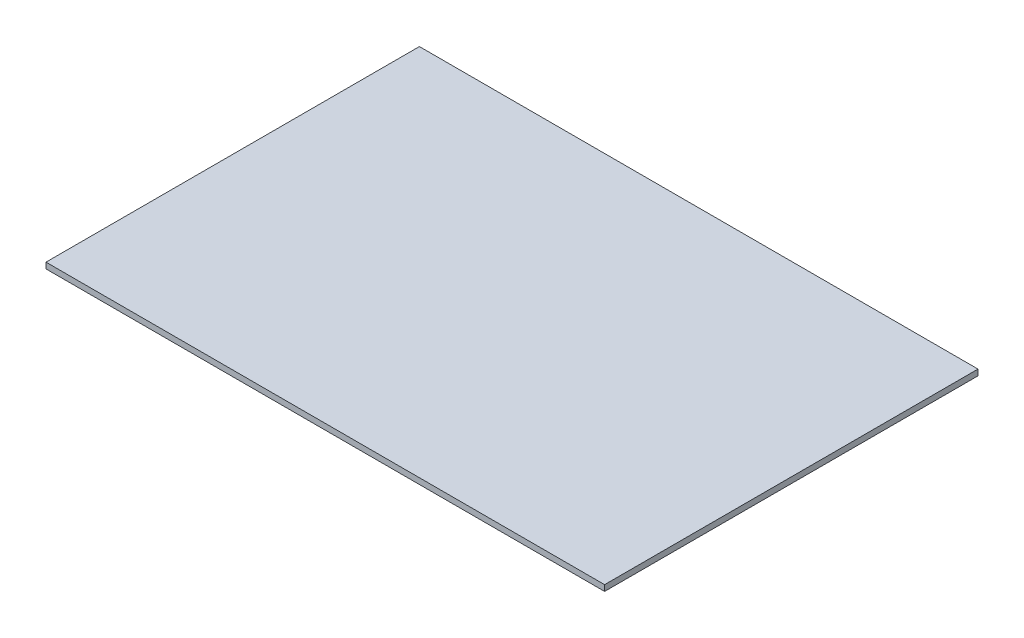
ISO-10303-21;
HEADER;
FILE_DESCRIPTION(('STEP AP214'),'2;1');
FILE_NAME('part.step','',(''),(''),'','','');
FILE_SCHEMA(('AUTOMOTIVE_DESIGN { 1 0 10303 214 1 1 1 1 }'));
ENDSEC;
DATA;
#1=APPLICATION_CONTEXT('core data for automotive mechanical design processes');
#2=APPLICATION_PROTOCOL_DEFINITION('international standard','automotive_design',2000,#1);
#3=PRODUCT_CONTEXT('',#1,'mechanical');
#4=PRODUCT('Part','Part','',(#3));
#5=PRODUCT_RELATED_PRODUCT_CATEGORY('part','',(#4));
#6=PRODUCT_DEFINITION_FORMATION('','',#4);
#7=PRODUCT_DEFINITION_CONTEXT('part definition',#1,'design');
#8=PRODUCT_DEFINITION('design','',#6,#7);
#9=PRODUCT_DEFINITION_SHAPE('','',#8);
#10=(LENGTH_UNIT() NAMED_UNIT(*) SI_UNIT(.MILLI.,.METRE.));
#11=(NAMED_UNIT(*) PLANE_ANGLE_UNIT() SI_UNIT($,.RADIAN.));
#12=(NAMED_UNIT(*) SI_UNIT($,.STERADIAN.) SOLID_ANGLE_UNIT());
#13=UNCERTAINTY_MEASURE_WITH_UNIT(LENGTH_MEASURE(1.E-05),#10,'distance_accuracy_value','');
#14=(GEOMETRIC_REPRESENTATION_CONTEXT(3) GLOBAL_UNCERTAINTY_ASSIGNED_CONTEXT((#13)) GLOBAL_UNIT_ASSIGNED_CONTEXT((#10,
#11,#12)) REPRESENTATION_CONTEXT('',''));
#15=CARTESIAN_POINT('',(0.,0.,0.));
#16=DIRECTION('',(0.,0.,1.));
#17=DIRECTION('',(1.,0.,0.));
#18=AXIS2_PLACEMENT_3D('',#15,#16,#17);
#19=CARTESIAN_POINT('',(-225.,4.75,150.4));
#20=DIRECTION('',(1.,0.,0.));
#21=DIRECTION('',(0.,0.,-1.));
#22=AXIS2_PLACEMENT_3D('',#19,#20,#21);
#23=PLANE('',#22);
#24=DIRECTION('',(0.,0.,1.));
#25=VECTOR('',#24,1.);
#26=CARTESIAN_POINT('',(-225.,0.,150.4));
#27=LINE('',#26,#25);
#28=CARTESIAN_POINT('',(-225.,0.,-150.4));
#29=VERTEX_POINT('',#28);
#30=CARTESIAN_POINT('',(-225.,0.,150.4));
#31=VERTEX_POINT('',#30);
#32=EDGE_CURVE('E96',#29,#31,#27,.T.);
#33=ORIENTED_EDGE('',*,*,#32,.T.);
#34=DIRECTION('',(0.,-1.,0.));
#35=VECTOR('',#34,1.);
#36=CARTESIAN_POINT('',(-225.,4.75,150.4));
#37=LINE('',#36,#35);
#38=CARTESIAN_POINT('',(-225.,4.75,150.4));
#39=VERTEX_POINT('',#38);
#40=EDGE_CURVE('E11',#39,#31,#37,.T.);
#41=ORIENTED_EDGE('',*,*,#40,.F.);
#42=DIRECTION('',(0.,0.,1.));
#43=VECTOR('',#42,1.);
#44=CARTESIAN_POINT('',(-225.,4.75,150.4));
#45=LINE('',#44,#43);
#46=CARTESIAN_POINT('',(-225.,4.75,-150.4));
#47=VERTEX_POINT('',#46);
#48=EDGE_CURVE('E84',#47,#39,#45,.T.);
#49=ORIENTED_EDGE('',*,*,#48,.F.);
#50=DIRECTION('',(0.,-1.,0.));
#51=VECTOR('',#50,1.);
#52=CARTESIAN_POINT('',(-225.,4.75,-150.4));
#53=LINE('',#52,#51);
#54=EDGE_CURVE('E92',#47,#29,#53,.T.);
#55=ORIENTED_EDGE('',*,*,#54,.T.);
#56=EDGE_LOOP('',(#33,#41,#49,#55));
#57=FACE_BOUND('',#56,.T.);
#58=ADVANCED_FACE('F33',(#57),#23,.F.);
#59=CARTESIAN_POINT('',(225.,4.75,150.4));
#60=DIRECTION('',(0.,0.,-1.));
#61=DIRECTION('',(-1.,0.,0.));
#62=AXIS2_PLACEMENT_3D('',#59,#60,#61);
#63=PLANE('',#62);
#64=DIRECTION('',(1.,0.,0.));
#65=VECTOR('',#64,1.);
#66=CARTESIAN_POINT('',(225.,0.,150.4));
#67=LINE('',#66,#65);
#68=CARTESIAN_POINT('',(225.,0.,150.4));
#69=VERTEX_POINT('',#68);
#70=EDGE_CURVE('E88',#31,#69,#67,.T.);
#71=ORIENTED_EDGE('',*,*,#70,.T.);
#72=DIRECTION('',(0.,-1.,0.));
#73=VECTOR('',#72,1.);
#74=CARTESIAN_POINT('',(225.,4.75,150.4));
#75=LINE('',#74,#73);
#76=CARTESIAN_POINT('',(225.,4.75,150.4));
#77=VERTEX_POINT('',#76);
#78=EDGE_CURVE('E41',#77,#69,#75,.T.);
#79=ORIENTED_EDGE('',*,*,#78,.F.);
#80=DIRECTION('',(1.,0.,0.));
#81=VECTOR('',#80,1.);
#82=CARTESIAN_POINT('',(225.,4.75,150.4));
#83=LINE('',#82,#81);
#84=EDGE_CURVE('E79',#39,#77,#83,.T.);
#85=ORIENTED_EDGE('',*,*,#84,.F.);
#86=ORIENTED_EDGE('',*,*,#40,.T.);
#87=EDGE_LOOP('',(#71,#79,#85,#86));
#88=FACE_BOUND('',#87,.T.);
#89=ADVANCED_FACE('F87',(#88),#63,.F.);
#90=CARTESIAN_POINT('',(225.,4.75,150.4));
#91=DIRECTION('',(-1.,0.,0.));
#92=DIRECTION('',(0.,0.,1.));
#93=AXIS2_PLACEMENT_3D('',#90,#91,#92);
#94=PLANE('',#93);
#95=DIRECTION('',(0.,0.,-1.));
#96=VECTOR('',#95,1.);
#97=CARTESIAN_POINT('',(225.,0.,150.4));
#98=LINE('',#97,#96);
#99=CARTESIAN_POINT('',(225.,0.,-150.4));
#100=VERTEX_POINT('',#99);
#101=EDGE_CURVE('E66',#69,#100,#98,.T.);
#102=ORIENTED_EDGE('',*,*,#101,.T.);
#103=DIRECTION('',(0.,-1.,0.));
#104=VECTOR('',#103,1.);
#105=CARTESIAN_POINT('',(225.,4.75,-150.4));
#106=LINE('',#105,#104);
#107=CARTESIAN_POINT('',(225.,4.75,-150.4));
#108=VERTEX_POINT('',#107);
#109=EDGE_CURVE('E89',#108,#100,#106,.T.);
#110=ORIENTED_EDGE('',*,*,#109,.F.);
#111=DIRECTION('',(0.,0.,-1.));
#112=VECTOR('',#111,1.);
#113=CARTESIAN_POINT('',(225.,4.75,150.4));
#114=LINE('',#113,#112);
#115=EDGE_CURVE('E82',#77,#108,#114,.T.);
#116=ORIENTED_EDGE('',*,*,#115,.F.);
#117=ORIENTED_EDGE('',*,*,#78,.T.);
#118=EDGE_LOOP('',(#102,#110,#116,#117));
#119=FACE_BOUND('',#118,.T.);
#120=ADVANCED_FACE('F90',(#119),#94,.F.);
#121=CARTESIAN_POINT('',(225.,4.75,-150.4));
#122=DIRECTION('',(0.,0.,1.));
#123=DIRECTION('',(1.,0.,0.));
#124=AXIS2_PLACEMENT_3D('',#121,#122,#123);
#125=PLANE('',#124);
#126=DIRECTION('',(-1.,0.,0.));
#127=VECTOR('',#126,1.);
#128=CARTESIAN_POINT('',(225.,0.,-150.4));
#129=LINE('',#128,#127);
#130=EDGE_CURVE('E72',#100,#29,#129,.T.);
#131=ORIENTED_EDGE('',*,*,#130,.T.);
#132=ORIENTED_EDGE('',*,*,#54,.F.);
#133=DIRECTION('',(-1.,0.,0.));
#134=VECTOR('',#133,1.);
#135=CARTESIAN_POINT('',(225.,4.75,-150.4));
#136=LINE('',#135,#134);
#137=EDGE_CURVE('E49',#108,#47,#136,.T.);
#138=ORIENTED_EDGE('',*,*,#137,.F.);
#139=ORIENTED_EDGE('',*,*,#109,.T.);
#140=EDGE_LOOP('',(#131,#132,#138,#139));
#141=FACE_BOUND('',#140,.T.);
#142=ADVANCED_FACE('F103',(#141),#125,.F.);
#143=CARTESIAN_POINT('',(0.,4.75,0.));
#144=DIRECTION('',(0.,1.,0.));
#145=DIRECTION('',(0.,0.,1.));
#146=AXIS2_PLACEMENT_3D('',#143,#144,#145);
#147=PLANE('',#146);
#148=ORIENTED_EDGE('',*,*,#48,.T.);
#149=ORIENTED_EDGE('',*,*,#84,.T.);
#150=ORIENTED_EDGE('',*,*,#115,.T.);
#151=ORIENTED_EDGE('',*,*,#137,.T.);
#152=EDGE_LOOP('',(#148,#149,#150,#151));
#153=FACE_BOUND('',#152,.T.);
#154=ADVANCED_FACE('F80',(#153),#147,.T.);
#155=CARTESIAN_POINT('',(0.,0.,0.));
#156=DIRECTION('',(0.,1.,0.));
#157=DIRECTION('',(0.,0.,1.));
#158=AXIS2_PLACEMENT_3D('',#155,#156,#157);
#159=PLANE('',#158);
#160=ORIENTED_EDGE('',*,*,#32,.F.);
#161=ORIENTED_EDGE('',*,*,#130,.F.);
#162=ORIENTED_EDGE('',*,*,#101,.F.);
#163=ORIENTED_EDGE('',*,*,#70,.F.);
#164=EDGE_LOOP('',(#160,#161,#162,#163));
#165=FACE_BOUND('',#164,.T.);
#166=ADVANCED_FACE('F106',(#165),#159,.F.);
#167=CLOSED_SHELL('',(#58,#89,#120,#142,#154,#166));
#168=MANIFOLD_SOLID_BREP('B2',#167);
#169=ADVANCED_BREP_SHAPE_REPRESENTATION('',(#18,#168),#14);
#170=SHAPE_DEFINITION_REPRESENTATION(#9,#169);
ENDSEC;
END-ISO-10303-21;
